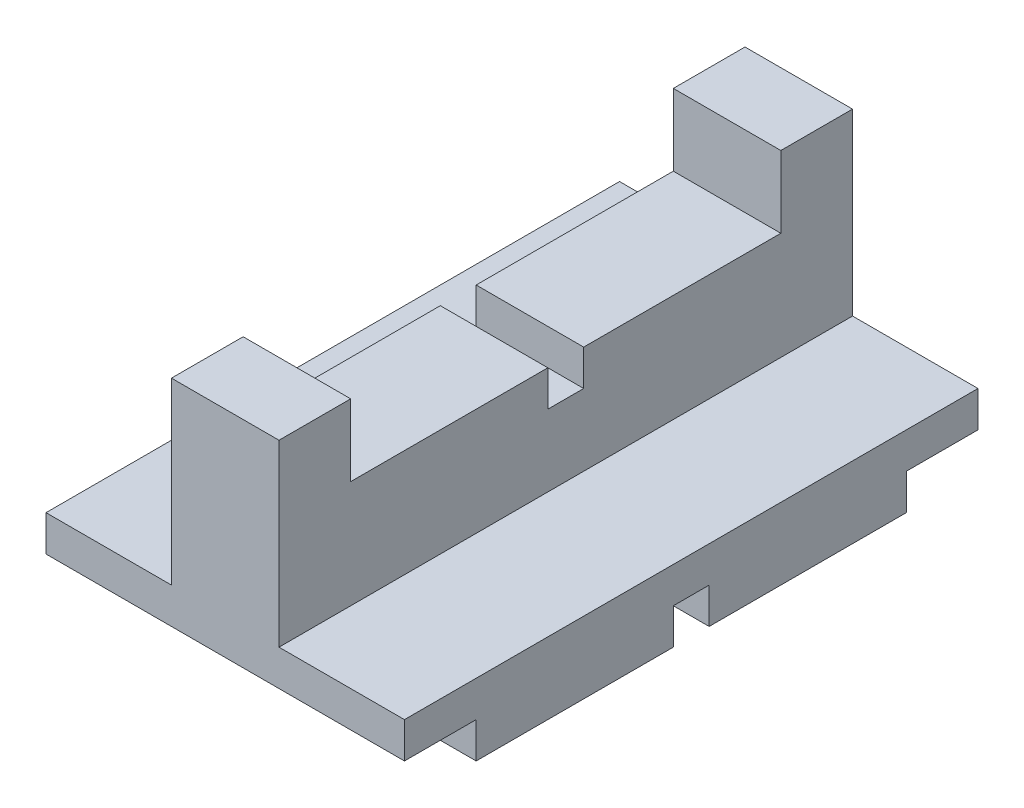
ISO-10303-21;
HEADER;
FILE_DESCRIPTION(('STEP AP214'),'2;1');
FILE_NAME('part.step','',(''),(''),'','','');
FILE_SCHEMA(('AUTOMOTIVE_DESIGN { 1 0 10303 214 1 1 1 1 }'));
ENDSEC;
DATA;
#1=APPLICATION_CONTEXT('core data for automotive mechanical design processes');
#2=APPLICATION_PROTOCOL_DEFINITION('international standard','automotive_design',2000,#1);
#3=PRODUCT_CONTEXT('',#1,'mechanical');
#4=PRODUCT('Part','Part','',(#3));
#5=PRODUCT_RELATED_PRODUCT_CATEGORY('part','',(#4));
#6=PRODUCT_DEFINITION_FORMATION('','',#4);
#7=PRODUCT_DEFINITION_CONTEXT('part definition',#1,'design');
#8=PRODUCT_DEFINITION('design','',#6,#7);
#9=PRODUCT_DEFINITION_SHAPE('','',#8);
#10=(LENGTH_UNIT() NAMED_UNIT(*) SI_UNIT(.MILLI.,.METRE.));
#11=(NAMED_UNIT(*) PLANE_ANGLE_UNIT() SI_UNIT($,.RADIAN.));
#12=(NAMED_UNIT(*) SI_UNIT($,.STERADIAN.) SOLID_ANGLE_UNIT());
#13=UNCERTAINTY_MEASURE_WITH_UNIT(LENGTH_MEASURE(1.E-05),#10,'distance_accuracy_value','');
#14=(GEOMETRIC_REPRESENTATION_CONTEXT(3) GLOBAL_UNCERTAINTY_ASSIGNED_CONTEXT((#13)) GLOBAL_UNIT_ASSIGNED_CONTEXT((#10,
#11,#12)) REPRESENTATION_CONTEXT('',''));
#15=CARTESIAN_POINT('',(0.,0.,0.));
#16=DIRECTION('',(0.,0.,1.));
#17=DIRECTION('',(1.,0.,0.));
#18=AXIS2_PLACEMENT_3D('',#15,#16,#17);
#19=CARTESIAN_POINT('',(-25.3606977763586,15.,70.));
#20=DIRECTION('',(0.,-1.,0.));
#21=DIRECTION('',(1.,0.,0.));
#22=AXIS2_PLACEMENT_3D('',#19,#20,#21);
#23=PLANE('',#22);
#24=DIRECTION('',(1.,0.,0.));
#25=VECTOR('',#24,1.);
#26=CARTESIAN_POINT('',(-25.3606977763586,15.,42.4997504993199));
#27=LINE('',#26,#25);
#28=CARTESIAN_POINT('',(-7.8606977763586,15.,42.4997504993199));
#29=VERTEX_POINT('',#28);
#30=CARTESIAN_POINT('',(7.13930222364139,15.,42.4997504993199));
#31=VERTEX_POINT('',#30);
#32=EDGE_CURVE('E200',#29,#31,#27,.T.);
#33=ORIENTED_EDGE('',*,*,#32,.F.);
#34=DIRECTION('',(0.,0.,-1.));
#35=VECTOR('',#34,1.);
#36=CARTESIAN_POINT('',(-7.8606977763586,15.,80.));
#37=LINE('',#36,#35);
#38=CARTESIAN_POINT('',(-7.8606977763586,15.,70.));
#39=VERTEX_POINT('',#38);
#40=EDGE_CURVE('E245',#39,#29,#37,.T.);
#41=ORIENTED_EDGE('',*,*,#40,.F.);
#42=DIRECTION('',(1.,0.,0.));
#43=VECTOR('',#42,1.);
#44=CARTESIAN_POINT('',(-25.3606977763586,15.,70.));
#45=LINE('',#44,#43);
#46=CARTESIAN_POINT('',(7.13930222364139,15.,70.));
#47=VERTEX_POINT('',#46);
#48=EDGE_CURVE('E225',#39,#47,#45,.T.);
#49=ORIENTED_EDGE('',*,*,#48,.T.);
#50=DIRECTION('',(0.,0.,-1.));
#51=VECTOR('',#50,1.);
#52=CARTESIAN_POINT('',(7.13930222364139,15.,70.));
#53=LINE('',#52,#51);
#54=EDGE_CURVE('E214',#47,#31,#53,.T.);
#55=ORIENTED_EDGE('',*,*,#54,.T.);
#56=EDGE_LOOP('',(#33,#41,#49,#55));
#57=FACE_BOUND('',#56,.T.);
#58=ADVANCED_FACE('F39',(#57),#23,.F.);
#59=CARTESIAN_POINT('',(-25.3606977763586,-10.,80.));
#60=DIRECTION('',(0.,1.,0.));
#61=DIRECTION('',(0.,0.,1.));
#62=AXIS2_PLACEMENT_3D('',#59,#60,#61);
#63=PLANE('',#62);
#64=DIRECTION('',(1.,0.,0.));
#65=VECTOR('',#64,1.);
#66=CARTESIAN_POINT('',(-25.3606977763586,-9.99999999999998,37.4997504993199));
#67=LINE('',#66,#65);
#68=CARTESIAN_POINT('',(-25.3606977763586,-9.99999999999998,37.4997504993199));
#69=VERTEX_POINT('',#68);
#70=CARTESIAN_POINT('',(24.6393022236414,-9.99999999999998,37.4997504993199));
#71=VERTEX_POINT('',#70);
#72=EDGE_CURVE('E379',#69,#71,#67,.T.);
#73=ORIENTED_EDGE('',*,*,#72,.F.);
#74=DIRECTION('',(0.,0.,-1.));
#75=VECTOR('',#74,1.);
#76=CARTESIAN_POINT('',(-25.3606977763586,-10.,80.));
#77=LINE('',#76,#75);
#78=CARTESIAN_POINT('',(-25.3606977763586,-9.99999999999998,10.));
#79=VERTEX_POINT('',#78);
#80=EDGE_CURVE('E298',#69,#79,#77,.T.);
#81=ORIENTED_EDGE('',*,*,#80,.T.);
#82=DIRECTION('',(1.,0.,0.));
#83=VECTOR('',#82,1.);
#84=CARTESIAN_POINT('',(-25.3606977763586,-9.99999999999998,10.));
#85=LINE('',#84,#83);
#86=CARTESIAN_POINT('',(24.6393022236414,-9.99999999999998,10.));
#87=VERTEX_POINT('',#86);
#88=EDGE_CURVE('E348',#79,#87,#85,.T.);
#89=ORIENTED_EDGE('',*,*,#88,.T.);
#90=DIRECTION('',(0.,0.,-1.));
#91=VECTOR('',#90,1.);
#92=CARTESIAN_POINT('',(24.6393022236414,-10.,80.));
#93=LINE('',#92,#91);
#94=EDGE_CURVE('E292',#71,#87,#93,.T.);
#95=ORIENTED_EDGE('',*,*,#94,.F.);
#96=EDGE_LOOP('',(#73,#81,#89,#95));
#97=FACE_BOUND('',#96,.T.);
#98=ADVANCED_FACE('F467',(#97),#63,.F.);
#99=CARTESIAN_POINT('',(-25.3606977763586,0.,80.));
#100=DIRECTION('',(1.,0.,0.));
#101=DIRECTION('',(0.,0.,-1.));
#102=AXIS2_PLACEMENT_3D('',#99,#100,#101);
#103=PLANE('',#102);
#104=ORIENTED_EDGE('',*,*,#80,.F.);
#105=DIRECTION('',(0.,1.,0.));
#106=VECTOR('',#105,1.);
#107=CARTESIAN_POINT('',(-25.3606977763586,-9.99999999999998,37.4997504993199));
#108=LINE('',#107,#106);
#109=CARTESIAN_POINT('',(-25.3606977763586,-4.99999999999998,37.4997504993199));
#110=VERTEX_POINT('',#109);
#111=EDGE_CURVE('E402',#69,#110,#108,.T.);
#112=ORIENTED_EDGE('',*,*,#111,.T.);
#113=DIRECTION('',(0.,0.,-1.));
#114=VECTOR('',#113,1.);
#115=CARTESIAN_POINT('',(-25.3606977763586,-4.99999999999998,42.4997504993199));
#116=LINE('',#115,#114);
#117=CARTESIAN_POINT('',(-25.3606977763586,-4.99999999999998,42.4997504993199));
#118=VERTEX_POINT('',#117);
#119=EDGE_CURVE('E391',#118,#110,#116,.T.);
#120=ORIENTED_EDGE('',*,*,#119,.F.);
#121=DIRECTION('',(0.,1.,0.));
#122=VECTOR('',#121,1.);
#123=CARTESIAN_POINT('',(-25.3606977763586,-9.99999999999998,42.4997504993199));
#124=LINE('',#123,#122);
#125=CARTESIAN_POINT('',(-25.3606977763586,-9.99999999999998,42.4997504993199));
#126=VERTEX_POINT('',#125);
#127=EDGE_CURVE('E393',#126,#118,#124,.T.);
#128=ORIENTED_EDGE('',*,*,#127,.F.);
#129=CARTESIAN_POINT('',(-25.3606977763586,-9.99999999999998,70.));
#130=VERTEX_POINT('',#129);
#131=EDGE_CURVE('E300',#130,#126,#77,.T.);
#132=ORIENTED_EDGE('',*,*,#131,.F.);
#133=DIRECTION('',(0.,-1.,0.));
#134=VECTOR('',#133,1.);
#135=CARTESIAN_POINT('',(-25.3606977763586,-4.99999999999998,70.));
#136=LINE('',#135,#134);
#137=CARTESIAN_POINT('',(-25.3606977763586,-4.99999999999998,70.));
#138=VERTEX_POINT('',#137);
#139=EDGE_CURVE('E336',#138,#130,#136,.T.);
#140=ORIENTED_EDGE('',*,*,#139,.F.);
#141=DIRECTION('',(0.,0.,-1.));
#142=VECTOR('',#141,1.);
#143=CARTESIAN_POINT('',(-25.3606977763586,-4.99999999999998,80.));
#144=LINE('',#143,#142);
#145=CARTESIAN_POINT('',(-25.3606977763586,-4.99999999999998,80.));
#146=VERTEX_POINT('',#145);
#147=EDGE_CURVE('E331',#146,#138,#144,.T.);
#148=ORIENTED_EDGE('',*,*,#147,.F.);
#149=DIRECTION('',(0.,-1.,0.));
#150=VECTOR('',#149,1.);
#151=CARTESIAN_POINT('',(-25.3606977763586,0.,80.));
#152=LINE('',#151,#150);
#153=CARTESIAN_POINT('',(-25.3606977763586,0.,80.));
#154=VERTEX_POINT('',#153);
#155=EDGE_CURVE('E252',#154,#146,#152,.T.);
#156=ORIENTED_EDGE('',*,*,#155,.F.);
#157=DIRECTION('',(0.,0.,-1.));
#158=VECTOR('',#157,1.);
#159=CARTESIAN_POINT('',(-25.3606977763586,0.,80.));
#160=LINE('',#159,#158);
#161=CARTESIAN_POINT('',(-25.3606977763586,0.,0.));
#162=VERTEX_POINT('',#161);
#163=EDGE_CURVE('E297',#154,#162,#160,.T.);
#164=ORIENTED_EDGE('',*,*,#163,.T.);
#165=DIRECTION('',(0.,-1.,0.));
#166=VECTOR('',#165,1.);
#167=CARTESIAN_POINT('',(-25.3606977763586,0.,0.));
#168=LINE('',#167,#166);
#169=CARTESIAN_POINT('',(-25.3606977763586,-4.99999999999998,0.));
#170=VERTEX_POINT('',#169);
#171=EDGE_CURVE('E270',#162,#170,#168,.T.);
#172=ORIENTED_EDGE('',*,*,#171,.T.);
#173=DIRECTION('',(0.,0.,-1.));
#174=VECTOR('',#173,1.);
#175=CARTESIAN_POINT('',(-25.3606977763586,-4.99999999999998,10.));
#176=LINE('',#175,#174);
#177=CARTESIAN_POINT('',(-25.3606977763586,-4.99999999999998,10.));
#178=VERTEX_POINT('',#177);
#179=EDGE_CURVE('E370',#178,#170,#176,.T.);
#180=ORIENTED_EDGE('',*,*,#179,.F.);
#181=DIRECTION('',(0.,-1.,0.));
#182=VECTOR('',#181,1.);
#183=CARTESIAN_POINT('',(-25.3606977763586,-4.99999999999998,10.));
#184=LINE('',#183,#182);
#185=EDGE_CURVE('E363',#178,#79,#184,.T.);
#186=ORIENTED_EDGE('',*,*,#185,.T.);
#187=EDGE_LOOP('',(#104,#112,#120,#128,#132,#140,#148,#156,#164,#172,#180,#186));
#188=FACE_BOUND('',#187,.T.);
#189=ADVANCED_FACE('F472',(#188),#103,.F.);
#190=ORIENTED_EDGE('',*,*,#131,.T.);
#191=DIRECTION('',(1.,0.,0.));
#192=VECTOR('',#191,1.);
#193=CARTESIAN_POINT('',(-25.3606977763586,-9.99999999999998,42.4997504993199));
#194=LINE('',#193,#192);
#195=CARTESIAN_POINT('',(24.6393022236414,-9.99999999999998,42.4997504993199));
#196=VERTEX_POINT('',#195);
#197=EDGE_CURVE('E381',#126,#196,#194,.T.);
#198=ORIENTED_EDGE('',*,*,#197,.T.);
#199=CARTESIAN_POINT('',(24.6393022236414,-9.99999999999998,70.));
#200=VERTEX_POINT('',#199);
#201=EDGE_CURVE('E291',#200,#196,#93,.T.);
#202=ORIENTED_EDGE('',*,*,#201,.F.);
#203=DIRECTION('',(1.,0.,0.));
#204=VECTOR('',#203,1.);
#205=CARTESIAN_POINT('',(-25.3606977763586,-9.99999999999998,70.));
#206=LINE('',#205,#204);
#207=EDGE_CURVE('E327',#130,#200,#206,.T.);
#208=ORIENTED_EDGE('',*,*,#207,.F.);
#209=EDGE_LOOP('',(#190,#198,#202,#208));
#210=FACE_BOUND('',#209,.T.);
#211=ADVANCED_FACE('F474',(#210),#63,.F.);
#212=CARTESIAN_POINT('',(-7.8606977763586,25.,80.));
#213=DIRECTION('',(0.,-1.,0.));
#214=DIRECTION('',(0.,0.,-1.));
#215=AXIS2_PLACEMENT_3D('',#212,#213,#214);
#216=PLANE('',#215);
#217=DIRECTION('',(1.,0.,0.));
#218=VECTOR('',#217,1.);
#219=CARTESIAN_POINT('',(-25.3606977763586,25.,70.));
#220=LINE('',#219,#218);
#221=CARTESIAN_POINT('',(-7.8606977763586,25.,70.));
#222=VERTEX_POINT('',#221);
#223=CARTESIAN_POINT('',(7.13930222364139,25.,70.));
#224=VERTEX_POINT('',#223);
#225=EDGE_CURVE('E235',#222,#224,#220,.T.);
#226=ORIENTED_EDGE('',*,*,#225,.F.);
#227=DIRECTION('',(0.,0.,-1.));
#228=VECTOR('',#227,1.);
#229=CARTESIAN_POINT('',(-7.8606977763586,25.,80.));
#230=LINE('',#229,#228);
#231=CARTESIAN_POINT('',(-7.8606977763586,25.,80.));
#232=VERTEX_POINT('',#231);
#233=EDGE_CURVE('E278',#232,#222,#230,.T.);
#234=ORIENTED_EDGE('',*,*,#233,.F.);
#235=DIRECTION('',(-1.,0.,0.));
#236=VECTOR('',#235,1.);
#237=CARTESIAN_POINT('',(-7.8606977763586,25.,80.));
#238=LINE('',#237,#236);
#239=CARTESIAN_POINT('',(7.13930222364139,25.,80.));
#240=VERTEX_POINT('',#239);
#241=EDGE_CURVE('E259',#240,#232,#238,.T.);
#242=ORIENTED_EDGE('',*,*,#241,.F.);
#243=DIRECTION('',(0.,0.,-1.));
#244=VECTOR('',#243,1.);
#245=CARTESIAN_POINT('',(7.13930222364139,25.,80.));
#246=LINE('',#245,#244);
#247=EDGE_CURVE('E282',#240,#224,#246,.T.);
#248=ORIENTED_EDGE('',*,*,#247,.T.);
#249=EDGE_LOOP('',(#226,#234,#242,#248));
#250=FACE_BOUND('',#249,.T.);
#251=ADVANCED_FACE('F439',(#250),#216,.F.);
#252=CARTESIAN_POINT('',(7.13930222364139,25.,80.));
#253=DIRECTION('',(-1.,0.,0.));
#254=DIRECTION('',(0.,-1.,0.));
#255=AXIS2_PLACEMENT_3D('',#252,#253,#254);
#256=PLANE('',#255);
#257=DIRECTION('',(0.,0.,1.));
#258=VECTOR('',#257,1.);
#259=CARTESIAN_POINT('',(7.1393022236414,10.,37.4997504993199));
#260=LINE('',#259,#258);
#261=CARTESIAN_POINT('',(7.1393022236414,10.,37.4997504993199));
#262=VERTEX_POINT('',#261);
#263=CARTESIAN_POINT('',(7.1393022236414,10.,42.4997504993199));
#264=VERTEX_POINT('',#263);
#265=EDGE_CURVE('E217',#262,#264,#260,.T.);
#266=ORIENTED_EDGE('',*,*,#265,.T.);
#267=DIRECTION('',(0.,1.,0.));
#268=VECTOR('',#267,1.);
#269=CARTESIAN_POINT('',(7.1393022236414,10.,42.4997504993199));
#270=LINE('',#269,#268);
#271=EDGE_CURVE('E205',#264,#31,#270,.T.);
#272=ORIENTED_EDGE('',*,*,#271,.T.);
#273=ORIENTED_EDGE('',*,*,#54,.F.);
#274=DIRECTION('',(0.,-1.,0.));
#275=VECTOR('',#274,1.);
#276=CARTESIAN_POINT('',(7.13930222364139,25.,70.));
#277=LINE('',#276,#275);
#278=EDGE_CURVE('E226',#224,#47,#277,.T.);
#279=ORIENTED_EDGE('',*,*,#278,.F.);
#280=ORIENTED_EDGE('',*,*,#247,.F.);
#281=DIRECTION('',(0.,1.,0.));
#282=VECTOR('',#281,1.);
#283=CARTESIAN_POINT('',(7.13930222364139,25.,80.));
#284=LINE('',#283,#282);
#285=CARTESIAN_POINT('',(7.1393022236414,0.,80.));
#286=VERTEX_POINT('',#285);
#287=EDGE_CURVE('E257',#286,#240,#284,.T.);
#288=ORIENTED_EDGE('',*,*,#287,.F.);
#289=DIRECTION('',(0.,0.,-1.));
#290=VECTOR('',#289,1.);
#291=CARTESIAN_POINT('',(7.1393022236414,0.,80.));
#292=LINE('',#291,#290);
#293=CARTESIAN_POINT('',(7.1393022236414,0.,0.));
#294=VERTEX_POINT('',#293);
#295=EDGE_CURVE('E288',#286,#294,#292,.T.);
#296=ORIENTED_EDGE('',*,*,#295,.T.);
#297=DIRECTION('',(0.,1.,0.));
#298=VECTOR('',#297,1.);
#299=CARTESIAN_POINT('',(7.13930222364139,25.,0.));
#300=LINE('',#299,#298);
#301=CARTESIAN_POINT('',(7.13930222364139,25.,0.));
#302=VERTEX_POINT('',#301);
#303=EDGE_CURVE('E274',#294,#302,#300,.T.);
#304=ORIENTED_EDGE('',*,*,#303,.T.);
#305=CARTESIAN_POINT('',(7.13930222364139,25.,10.));
#306=VERTEX_POINT('',#305);
#307=EDGE_CURVE('E284',#306,#302,#246,.T.);
#308=ORIENTED_EDGE('',*,*,#307,.F.);
#309=DIRECTION('',(0.,-1.,0.));
#310=VECTOR('',#309,1.);
#311=CARTESIAN_POINT('',(7.13930222364139,25.,10.));
#312=LINE('',#311,#310);
#313=CARTESIAN_POINT('',(7.13930222364139,15.,10.));
#314=VERTEX_POINT('',#313);
#315=EDGE_CURVE('E221',#306,#314,#312,.T.);
#316=ORIENTED_EDGE('',*,*,#315,.T.);
#317=CARTESIAN_POINT('',(7.13930222364139,15.,37.4997504993199));
#318=VERTEX_POINT('',#317);
#319=EDGE_CURVE('E222',#318,#314,#53,.T.);
#320=ORIENTED_EDGE('',*,*,#319,.F.);
#321=DIRECTION('',(0.,1.,0.));
#322=VECTOR('',#321,1.);
#323=CARTESIAN_POINT('',(7.1393022236414,10.,37.4997504993199));
#324=LINE('',#323,#322);
#325=EDGE_CURVE('E209',#262,#318,#324,.T.);
#326=ORIENTED_EDGE('',*,*,#325,.F.);
#327=EDGE_LOOP('',(#266,#272,#273,#279,#280,#288,#296,#304,#308,#316,#320,#326));
#328=FACE_BOUND('',#327,.T.);
#329=ADVANCED_FACE('F212',(#328),#256,.F.);
#330=CARTESIAN_POINT('',(-7.8606977763586,0.,80.));
#331=DIRECTION('',(1.,0.,0.));
#332=DIRECTION('',(0.,0.,-1.));
#333=AXIS2_PLACEMENT_3D('',#330,#331,#332);
#334=PLANE('',#333);
#335=DIRECTION('',(0.,0.,1.));
#336=VECTOR('',#335,1.);
#337=CARTESIAN_POINT('',(-7.8606977763586,10.,80.));
#338=LINE('',#337,#336);
#339=CARTESIAN_POINT('',(-7.8606977763586,10.,37.4997504993199));
#340=VERTEX_POINT('',#339);
#341=CARTESIAN_POINT('',(-7.8606977763586,10.,42.4997504993199));
#342=VERTEX_POINT('',#341);
#343=EDGE_CURVE('E50',#340,#342,#338,.T.);
#344=ORIENTED_EDGE('',*,*,#343,.F.);
#345=DIRECTION('',(0.,1.,0.));
#346=VECTOR('',#345,1.);
#347=CARTESIAN_POINT('',(-7.8606977763586,0.,37.4997504993199));
#348=LINE('',#347,#346);
#349=CARTESIAN_POINT('',(-7.8606977763586,15.,37.4997504993199));
#350=VERTEX_POINT('',#349);
#351=EDGE_CURVE('E11',#340,#350,#348,.T.);
#352=ORIENTED_EDGE('',*,*,#351,.T.);
#353=CARTESIAN_POINT('',(-7.8606977763586,15.,10.));
#354=VERTEX_POINT('',#353);
#355=EDGE_CURVE('E234',#350,#354,#37,.T.);
#356=ORIENTED_EDGE('',*,*,#355,.T.);
#357=DIRECTION('',(0.,-1.,0.));
#358=VECTOR('',#357,1.);
#359=CARTESIAN_POINT('',(-7.8606977763586,0.,10.));
#360=LINE('',#359,#358);
#361=CARTESIAN_POINT('',(-7.8606977763586,25.,10.));
#362=VERTEX_POINT('',#361);
#363=EDGE_CURVE('E306',#362,#354,#360,.T.);
#364=ORIENTED_EDGE('',*,*,#363,.F.);
#365=CARTESIAN_POINT('',(-7.8606977763586,25.,0.));
#366=VERTEX_POINT('',#365);
#367=EDGE_CURVE('E264',#362,#366,#230,.T.);
#368=ORIENTED_EDGE('',*,*,#367,.T.);
#369=DIRECTION('',(0.,-1.,0.));
#370=VECTOR('',#369,1.);
#371=CARTESIAN_POINT('',(-7.8606977763586,0.,0.));
#372=LINE('',#371,#370);
#373=CARTESIAN_POINT('',(-7.8606977763586,0.,0.));
#374=VERTEX_POINT('',#373);
#375=EDGE_CURVE('E242',#366,#374,#372,.T.);
#376=ORIENTED_EDGE('',*,*,#375,.T.);
#377=DIRECTION('',(0.,0.,-1.));
#378=VECTOR('',#377,1.);
#379=CARTESIAN_POINT('',(-7.8606977763586,0.,80.));
#380=LINE('',#379,#378);
#381=CARTESIAN_POINT('',(-7.8606977763586,0.,80.));
#382=VERTEX_POINT('',#381);
#383=EDGE_CURVE('E303',#382,#374,#380,.T.);
#384=ORIENTED_EDGE('',*,*,#383,.F.);
#385=DIRECTION('',(0.,-1.,0.));
#386=VECTOR('',#385,1.);
#387=CARTESIAN_POINT('',(-7.8606977763586,0.,80.));
#388=LINE('',#387,#386);
#389=EDGE_CURVE('E244',#232,#382,#388,.T.);
#390=ORIENTED_EDGE('',*,*,#389,.F.);
#391=ORIENTED_EDGE('',*,*,#233,.T.);
#392=DIRECTION('',(0.,-1.,0.));
#393=VECTOR('',#392,1.);
#394=CARTESIAN_POINT('',(-7.8606977763586,0.,70.));
#395=LINE('',#394,#393);
#396=EDGE_CURVE('E307',#222,#39,#395,.T.);
#397=ORIENTED_EDGE('',*,*,#396,.T.);
#398=ORIENTED_EDGE('',*,*,#40,.T.);
#399=DIRECTION('',(0.,1.,0.));
#400=VECTOR('',#399,1.);
#401=CARTESIAN_POINT('',(-7.8606977763586,0.,42.4997504993199));
#402=LINE('',#401,#400);
#403=EDGE_CURVE('E204',#342,#29,#402,.T.);
#404=ORIENTED_EDGE('',*,*,#403,.F.);
#405=EDGE_LOOP('',(#344,#352,#356,#364,#368,#376,#384,#390,#391,#397,#398,#404));
#406=FACE_BOUND('',#405,.T.);
#407=ADVANCED_FACE('F41',(#406),#334,.F.);
#408=CARTESIAN_POINT('',(-7.8606977763586,0.,80.));
#409=DIRECTION('',(0.,-1.,0.));
#410=DIRECTION('',(1.,0.,0.));
#411=AXIS2_PLACEMENT_3D('',#408,#409,#410);
#412=PLANE('',#411);
#413=DIRECTION('',(-1.,0.,0.));
#414=VECTOR('',#413,1.);
#415=CARTESIAN_POINT('',(-7.8606977763586,0.,0.));
#416=LINE('',#415,#414);
#417=EDGE_CURVE('E261',#374,#162,#416,.T.);
#418=ORIENTED_EDGE('',*,*,#417,.T.);
#419=ORIENTED_EDGE('',*,*,#163,.F.);
#420=DIRECTION('',(-1.,0.,0.));
#421=VECTOR('',#420,1.);
#422=CARTESIAN_POINT('',(-7.8606977763586,0.,80.));
#423=LINE('',#422,#421);
#424=EDGE_CURVE('E247',#382,#154,#423,.T.);
#425=ORIENTED_EDGE('',*,*,#424,.F.);
#426=ORIENTED_EDGE('',*,*,#383,.T.);
#427=EDGE_LOOP('',(#418,#419,#425,#426));
#428=FACE_BOUND('',#427,.T.);
#429=ADVANCED_FACE('F432',(#428),#412,.F.);
#430=CARTESIAN_POINT('',(24.6393022236414,-10.,80.));
#431=DIRECTION('',(-1.,0.,0.));
#432=DIRECTION('',(0.,-1.,0.));
#433=AXIS2_PLACEMENT_3D('',#430,#431,#432);
#434=PLANE('',#433);
#435=ORIENTED_EDGE('',*,*,#201,.T.);
#436=DIRECTION('',(0.,1.,0.));
#437=VECTOR('',#436,1.);
#438=CARTESIAN_POINT('',(24.6393022236414,-9.99999999999998,42.4997504993199));
#439=LINE('',#438,#437);
#440=CARTESIAN_POINT('',(24.6393022236414,-4.99999999999998,42.4997504993199));
#441=VERTEX_POINT('',#440);
#442=EDGE_CURVE('E394',#196,#441,#439,.T.);
#443=ORIENTED_EDGE('',*,*,#442,.T.);
#444=DIRECTION('',(0.,0.,-1.));
#445=VECTOR('',#444,1.);
#446=CARTESIAN_POINT('',(24.6393022236414,-4.99999999999998,42.4997504993199));
#447=LINE('',#446,#445);
#448=CARTESIAN_POINT('',(24.6393022236414,-4.99999999999998,37.4997504993199));
#449=VERTEX_POINT('',#448);
#450=EDGE_CURVE('E400',#441,#449,#447,.T.);
#451=ORIENTED_EDGE('',*,*,#450,.T.);
#452=DIRECTION('',(0.,1.,0.));
#453=VECTOR('',#452,1.);
#454=CARTESIAN_POINT('',(24.6393022236414,-9.99999999999998,37.4997504993199));
#455=LINE('',#454,#453);
#456=EDGE_CURVE('E65',#71,#449,#455,.T.);
#457=ORIENTED_EDGE('',*,*,#456,.F.);
#458=ORIENTED_EDGE('',*,*,#94,.T.);
#459=DIRECTION('',(0.,-1.,0.));
#460=VECTOR('',#459,1.);
#461=CARTESIAN_POINT('',(24.6393022236414,-4.99999999999998,10.));
#462=LINE('',#461,#460);
#463=CARTESIAN_POINT('',(24.6393022236414,-4.99999999999998,10.));
#464=VERTEX_POINT('',#463);
#465=EDGE_CURVE('E360',#464,#87,#462,.T.);
#466=ORIENTED_EDGE('',*,*,#465,.F.);
#467=DIRECTION('',(0.,0.,-1.));
#468=VECTOR('',#467,1.);
#469=CARTESIAN_POINT('',(24.6393022236414,-4.99999999999998,10.));
#470=LINE('',#469,#468);
#471=CARTESIAN_POINT('',(24.6393022236414,-4.99999999999998,0.));
#472=VERTEX_POINT('',#471);
#473=EDGE_CURVE('E374',#464,#472,#470,.T.);
#474=ORIENTED_EDGE('',*,*,#473,.T.);
#475=DIRECTION('',(0.,1.,0.));
#476=VECTOR('',#475,1.);
#477=CARTESIAN_POINT('',(24.6393022236414,-10.,0.));
#478=LINE('',#477,#476);
#479=CARTESIAN_POINT('',(24.6393022236414,0.,0.));
#480=VERTEX_POINT('',#479);
#481=EDGE_CURVE('E269',#472,#480,#478,.T.);
#482=ORIENTED_EDGE('',*,*,#481,.T.);
#483=DIRECTION('',(0.,0.,-1.));
#484=VECTOR('',#483,1.);
#485=CARTESIAN_POINT('',(24.6393022236414,0.,80.));
#486=LINE('',#485,#484);
#487=CARTESIAN_POINT('',(24.6393022236414,0.,80.));
#488=VERTEX_POINT('',#487);
#489=EDGE_CURVE('E287',#488,#480,#486,.T.);
#490=ORIENTED_EDGE('',*,*,#489,.F.);
#491=DIRECTION('',(0.,1.,0.));
#492=VECTOR('',#491,1.);
#493=CARTESIAN_POINT('',(24.6393022236414,-10.,80.));
#494=LINE('',#493,#492);
#495=CARTESIAN_POINT('',(24.6393022236414,-4.99999999999998,80.));
#496=VERTEX_POINT('',#495);
#497=EDGE_CURVE('E251',#496,#488,#494,.T.);
#498=ORIENTED_EDGE('',*,*,#497,.F.);
#499=DIRECTION('',(0.,0.,-1.));
#500=VECTOR('',#499,1.);
#501=CARTESIAN_POINT('',(24.6393022236414,-4.99999999999998,80.));
#502=LINE('',#501,#500);
#503=CARTESIAN_POINT('',(24.6393022236414,-4.99999999999998,70.));
#504=VERTEX_POINT('',#503);
#505=EDGE_CURVE('E333',#496,#504,#502,.T.);
#506=ORIENTED_EDGE('',*,*,#505,.T.);
#507=DIRECTION('',(0.,-1.,0.));
#508=VECTOR('',#507,1.);
#509=CARTESIAN_POINT('',(24.6393022236414,-4.99999999999998,70.));
#510=LINE('',#509,#508);
#511=EDGE_CURVE('E344',#504,#200,#510,.T.);
#512=ORIENTED_EDGE('',*,*,#511,.T.);
#513=EDGE_LOOP('',(#435,#443,#451,#457,#458,#466,#474,#482,#490,#498,#506,#512));
#514=FACE_BOUND('',#513,.T.);
#515=ADVANCED_FACE('F449',(#514),#434,.F.);
#516=CARTESIAN_POINT('',(24.6393022236414,0.,80.));
#517=DIRECTION('',(0.,-1.,0.));
#518=DIRECTION('',(1.,0.,0.));
#519=AXIS2_PLACEMENT_3D('',#516,#517,#518);
#520=PLANE('',#519);
#521=DIRECTION('',(-1.,0.,0.));
#522=VECTOR('',#521,1.);
#523=CARTESIAN_POINT('',(24.6393022236414,0.,0.));
#524=LINE('',#523,#522);
#525=EDGE_CURVE('E275',#480,#294,#524,.T.);
#526=ORIENTED_EDGE('',*,*,#525,.T.);
#527=ORIENTED_EDGE('',*,*,#295,.F.);
#528=DIRECTION('',(-1.,0.,0.));
#529=VECTOR('',#528,1.);
#530=CARTESIAN_POINT('',(24.6393022236414,0.,80.));
#531=LINE('',#530,#529);
#532=EDGE_CURVE('E256',#488,#286,#531,.T.);
#533=ORIENTED_EDGE('',*,*,#532,.F.);
#534=ORIENTED_EDGE('',*,*,#489,.T.);
#535=EDGE_LOOP('',(#526,#527,#533,#534));
#536=FACE_BOUND('',#535,.T.);
#537=ADVANCED_FACE('F447',(#536),#520,.F.);
#538=ORIENTED_EDGE('',*,*,#367,.F.);
#539=DIRECTION('',(1.,0.,0.));
#540=VECTOR('',#539,1.);
#541=CARTESIAN_POINT('',(-25.3606977763586,25.,10.));
#542=LINE('',#541,#540);
#543=EDGE_CURVE('E232',#362,#306,#542,.T.);
#544=ORIENTED_EDGE('',*,*,#543,.T.);
#545=ORIENTED_EDGE('',*,*,#307,.T.);
#546=DIRECTION('',(-1.,0.,0.));
#547=VECTOR('',#546,1.);
#548=CARTESIAN_POINT('',(-7.8606977763586,25.,0.));
#549=LINE('',#548,#547);
#550=EDGE_CURVE('E248',#302,#366,#549,.T.);
#551=ORIENTED_EDGE('',*,*,#550,.T.);
#552=EDGE_LOOP('',(#538,#544,#545,#551));
#553=FACE_BOUND('',#552,.T.);
#554=ADVANCED_FACE('F421',(#553),#216,.F.);
#555=CARTESIAN_POINT('',(0.,0.,80.));
#556=DIRECTION('',(0.,0.,-1.));
#557=DIRECTION('',(-1.,0.,0.));
#558=AXIS2_PLACEMENT_3D('',#555,#556,#557);
#559=PLANE('',#558);
#560=ORIENTED_EDGE('',*,*,#155,.T.);
#561=DIRECTION('',(1.,0.,0.));
#562=VECTOR('',#561,1.);
#563=CARTESIAN_POINT('',(-25.3606977763586,-4.99999999999998,80.));
#564=LINE('',#563,#562);
#565=EDGE_CURVE('E325',#146,#496,#564,.T.);
#566=ORIENTED_EDGE('',*,*,#565,.T.);
#567=ORIENTED_EDGE('',*,*,#497,.T.);
#568=ORIENTED_EDGE('',*,*,#532,.T.);
#569=ORIENTED_EDGE('',*,*,#287,.T.);
#570=ORIENTED_EDGE('',*,*,#241,.T.);
#571=ORIENTED_EDGE('',*,*,#389,.T.);
#572=ORIENTED_EDGE('',*,*,#424,.T.);
#573=EDGE_LOOP('',(#560,#566,#567,#568,#569,#570,#571,#572));
#574=FACE_BOUND('',#573,.T.);
#575=ADVANCED_FACE('F436',(#574),#559,.F.);
#576=CARTESIAN_POINT('',(0.,0.,0.));
#577=DIRECTION('',(0.,0.,-1.));
#578=DIRECTION('',(-1.,0.,0.));
#579=AXIS2_PLACEMENT_3D('',#576,#577,#578);
#580=PLANE('',#579);
#581=DIRECTION('',(1.,0.,0.));
#582=VECTOR('',#581,1.);
#583=CARTESIAN_POINT('',(-25.3606977763586,-4.99999999999998,0.));
#584=LINE('',#583,#582);
#585=EDGE_CURVE('E358',#170,#472,#584,.T.);
#586=ORIENTED_EDGE('',*,*,#585,.F.);
#587=ORIENTED_EDGE('',*,*,#171,.F.);
#588=ORIENTED_EDGE('',*,*,#417,.F.);
#589=ORIENTED_EDGE('',*,*,#375,.F.);
#590=ORIENTED_EDGE('',*,*,#550,.F.);
#591=ORIENTED_EDGE('',*,*,#303,.F.);
#592=ORIENTED_EDGE('',*,*,#525,.F.);
#593=ORIENTED_EDGE('',*,*,#481,.F.);
#594=EDGE_LOOP('',(#586,#587,#588,#589,#590,#591,#592,#593));
#595=FACE_BOUND('',#594,.T.);
#596=ADVANCED_FACE('F429',(#595),#580,.T.);
#597=CARTESIAN_POINT('',(-25.3606977763586,25.,70.));
#598=DIRECTION('',(0.,0.,1.));
#599=DIRECTION('',(1.,0.,0.));
#600=AXIS2_PLACEMENT_3D('',#597,#598,#599);
#601=PLANE('',#600);
#602=ORIENTED_EDGE('',*,*,#225,.T.);
#603=ORIENTED_EDGE('',*,*,#278,.T.);
#604=ORIENTED_EDGE('',*,*,#48,.F.);
#605=ORIENTED_EDGE('',*,*,#396,.F.);
#606=EDGE_LOOP('',(#602,#603,#604,#605));
#607=FACE_BOUND('',#606,.T.);
#608=ADVANCED_FACE('F316',(#607),#601,.F.);
#609=CARTESIAN_POINT('',(-25.3606977763586,25.,10.));
#610=DIRECTION('',(0.,0.,1.));
#611=DIRECTION('',(1.,0.,0.));
#612=AXIS2_PLACEMENT_3D('',#609,#610,#611);
#613=PLANE('',#612);
#614=ORIENTED_EDGE('',*,*,#363,.T.);
#615=DIRECTION('',(1.,0.,0.));
#616=VECTOR('',#615,1.);
#617=CARTESIAN_POINT('',(-25.3606977763586,15.,10.));
#618=LINE('',#617,#616);
#619=EDGE_CURVE('E238',#354,#314,#618,.T.);
#620=ORIENTED_EDGE('',*,*,#619,.T.);
#621=ORIENTED_EDGE('',*,*,#315,.F.);
#622=ORIENTED_EDGE('',*,*,#543,.F.);
#623=EDGE_LOOP('',(#614,#620,#621,#622));
#624=FACE_BOUND('',#623,.T.);
#625=ADVANCED_FACE('F417',(#624),#613,.T.);
#626=ORIENTED_EDGE('',*,*,#355,.F.);
#627=DIRECTION('',(1.,0.,0.));
#628=VECTOR('',#627,1.);
#629=CARTESIAN_POINT('',(-25.3606977763586,15.,37.4997504993199));
#630=LINE('',#629,#628);
#631=EDGE_CURVE('E397',#350,#318,#630,.T.);
#632=ORIENTED_EDGE('',*,*,#631,.T.);
#633=ORIENTED_EDGE('',*,*,#319,.T.);
#634=ORIENTED_EDGE('',*,*,#619,.F.);
#635=EDGE_LOOP('',(#626,#632,#633,#634));
#636=FACE_BOUND('',#635,.T.);
#637=ADVANCED_FACE('F411',(#636),#23,.F.);
#638=CARTESIAN_POINT('',(-25.3606977763586,-4.99999999999998,80.));
#639=DIRECTION('',(0.,-1.,0.));
#640=DIRECTION('',(0.,0.,-1.));
#641=AXIS2_PLACEMENT_3D('',#638,#639,#640);
#642=PLANE('',#641);
#643=ORIENTED_EDGE('',*,*,#505,.F.);
#644=ORIENTED_EDGE('',*,*,#565,.F.);
#645=ORIENTED_EDGE('',*,*,#147,.T.);
#646=DIRECTION('',(1.,0.,0.));
#647=VECTOR('',#646,1.);
#648=CARTESIAN_POINT('',(-25.3606977763586,-4.99999999999998,70.));
#649=LINE('',#648,#647);
#650=EDGE_CURVE('E323',#138,#504,#649,.T.);
#651=ORIENTED_EDGE('',*,*,#650,.T.);
#652=EDGE_LOOP('',(#643,#644,#645,#651));
#653=FACE_BOUND('',#652,.T.);
#654=ADVANCED_FACE('F446',(#653),#642,.T.);
#655=CARTESIAN_POINT('',(-25.3606977763586,-4.99999999999998,70.));
#656=DIRECTION('',(0.,0.,1.));
#657=DIRECTION('',(1.,0.,0.));
#658=AXIS2_PLACEMENT_3D('',#655,#656,#657);
#659=PLANE('',#658);
#660=ORIENTED_EDGE('',*,*,#511,.F.);
#661=ORIENTED_EDGE('',*,*,#650,.F.);
#662=ORIENTED_EDGE('',*,*,#139,.T.);
#663=ORIENTED_EDGE('',*,*,#207,.T.);
#664=EDGE_LOOP('',(#660,#661,#662,#663));
#665=FACE_BOUND('',#664,.T.);
#666=ADVANCED_FACE('F451',(#665),#659,.T.);
#667=CARTESIAN_POINT('',(-25.3606977763586,-4.99999999999998,10.));
#668=DIRECTION('',(0.,0.,1.));
#669=DIRECTION('',(1.,0.,0.));
#670=AXIS2_PLACEMENT_3D('',#667,#668,#669);
#671=PLANE('',#670);
#672=ORIENTED_EDGE('',*,*,#465,.T.);
#673=ORIENTED_EDGE('',*,*,#88,.F.);
#674=ORIENTED_EDGE('',*,*,#185,.F.);
#675=DIRECTION('',(1.,0.,0.));
#676=VECTOR('',#675,1.);
#677=CARTESIAN_POINT('',(-25.3606977763586,-4.99999999999998,10.));
#678=LINE('',#677,#676);
#679=EDGE_CURVE('E353',#178,#464,#678,.T.);
#680=ORIENTED_EDGE('',*,*,#679,.T.);
#681=EDGE_LOOP('',(#672,#673,#674,#680));
#682=FACE_BOUND('',#681,.T.);
#683=ADVANCED_FACE('F452',(#682),#671,.F.);
#684=CARTESIAN_POINT('',(-25.3606977763586,-4.99999999999998,10.));
#685=DIRECTION('',(0.,-1.,0.));
#686=DIRECTION('',(0.,0.,-1.));
#687=AXIS2_PLACEMENT_3D('',#684,#685,#686);
#688=PLANE('',#687);
#689=ORIENTED_EDGE('',*,*,#473,.F.);
#690=ORIENTED_EDGE('',*,*,#679,.F.);
#691=ORIENTED_EDGE('',*,*,#179,.T.);
#692=ORIENTED_EDGE('',*,*,#585,.T.);
#693=EDGE_LOOP('',(#689,#690,#691,#692));
#694=FACE_BOUND('',#693,.T.);
#695=ADVANCED_FACE('F456',(#694),#688,.T.);
#696=CARTESIAN_POINT('',(-25.3606977763586,-4.99999999999998,42.4997504993199));
#697=DIRECTION('',(0.,-1.,0.));
#698=DIRECTION('',(0.,0.,-1.));
#699=AXIS2_PLACEMENT_3D('',#696,#697,#698);
#700=PLANE('',#699);
#701=ORIENTED_EDGE('',*,*,#450,.F.);
#702=DIRECTION('',(1.,0.,0.));
#703=VECTOR('',#702,1.);
#704=CARTESIAN_POINT('',(-25.3606977763586,-4.99999999999998,42.4997504993199));
#705=LINE('',#704,#703);
#706=EDGE_CURVE('E388',#118,#441,#705,.T.);
#707=ORIENTED_EDGE('',*,*,#706,.F.);
#708=ORIENTED_EDGE('',*,*,#119,.T.);
#709=DIRECTION('',(1.,0.,0.));
#710=VECTOR('',#709,1.);
#711=CARTESIAN_POINT('',(-25.3606977763586,-4.99999999999998,37.4997504993199));
#712=LINE('',#711,#710);
#713=EDGE_CURVE('E376',#110,#449,#712,.T.);
#714=ORIENTED_EDGE('',*,*,#713,.T.);
#715=EDGE_LOOP('',(#701,#707,#708,#714));
#716=FACE_BOUND('',#715,.T.);
#717=ADVANCED_FACE('F569',(#716),#700,.T.);
#718=CARTESIAN_POINT('',(-25.3606977763586,-9.99999999999998,37.4997504993199));
#719=DIRECTION('',(0.,0.,-1.));
#720=DIRECTION('',(-1.,0.,0.));
#721=AXIS2_PLACEMENT_3D('',#718,#719,#720);
#722=PLANE('',#721);
#723=ORIENTED_EDGE('',*,*,#456,.T.);
#724=ORIENTED_EDGE('',*,*,#713,.F.);
#725=ORIENTED_EDGE('',*,*,#111,.F.);
#726=ORIENTED_EDGE('',*,*,#72,.T.);
#727=EDGE_LOOP('',(#723,#724,#725,#726));
#728=FACE_BOUND('',#727,.T.);
#729=ADVANCED_FACE('F582',(#728),#722,.F.);
#730=CARTESIAN_POINT('',(-25.3606977763586,-9.99999999999998,42.4997504993199));
#731=DIRECTION('',(0.,0.,-1.));
#732=DIRECTION('',(-1.,0.,0.));
#733=AXIS2_PLACEMENT_3D('',#730,#731,#732);
#734=PLANE('',#733);
#735=ORIENTED_EDGE('',*,*,#442,.F.);
#736=ORIENTED_EDGE('',*,*,#197,.F.);
#737=ORIENTED_EDGE('',*,*,#127,.T.);
#738=ORIENTED_EDGE('',*,*,#706,.T.);
#739=EDGE_LOOP('',(#735,#736,#737,#738));
#740=FACE_BOUND('',#739,.T.);
#741=ADVANCED_FACE('F593',(#740),#734,.T.);
#742=CARTESIAN_POINT('',(-25.3606977763586,10.,37.4997504993199));
#743=DIRECTION('',(0.,0.,-1.));
#744=DIRECTION('',(-1.,0.,0.));
#745=AXIS2_PLACEMENT_3D('',#742,#743,#744);
#746=PLANE('',#745);
#747=DIRECTION('',(1.,0.,0.));
#748=VECTOR('',#747,1.);
#749=CARTESIAN_POINT('',(-25.3606977763586,10.,37.4997504993199));
#750=LINE('',#749,#748);
#751=EDGE_CURVE('E317',#340,#262,#750,.T.);
#752=ORIENTED_EDGE('',*,*,#751,.T.);
#753=ORIENTED_EDGE('',*,*,#325,.T.);
#754=ORIENTED_EDGE('',*,*,#631,.F.);
#755=ORIENTED_EDGE('',*,*,#351,.F.);
#756=EDGE_LOOP('',(#752,#753,#754,#755));
#757=FACE_BOUND('',#756,.T.);
#758=ADVANCED_FACE('F413',(#757),#746,.F.);
#759=CARTESIAN_POINT('',(-25.3606977763586,10.,37.4997504993199));
#760=DIRECTION('',(0.,1.,0.));
#761=DIRECTION('',(-1.,0.,0.));
#762=AXIS2_PLACEMENT_3D('',#759,#760,#761);
#763=PLANE('',#762);
#764=ORIENTED_EDGE('',*,*,#343,.T.);
#765=DIRECTION('',(1.,0.,0.));
#766=VECTOR('',#765,1.);
#767=CARTESIAN_POINT('',(-25.3606977763586,10.,42.4997504993199));
#768=LINE('',#767,#766);
#769=EDGE_CURVE('E53',#342,#264,#768,.T.);
#770=ORIENTED_EDGE('',*,*,#769,.T.);
#771=ORIENTED_EDGE('',*,*,#265,.F.);
#772=ORIENTED_EDGE('',*,*,#751,.F.);
#773=EDGE_LOOP('',(#764,#770,#771,#772));
#774=FACE_BOUND('',#773,.T.);
#775=ADVANCED_FACE('F314',(#774),#763,.T.);
#776=CARTESIAN_POINT('',(-25.3606977763586,10.,42.4997504993199));
#777=DIRECTION('',(0.,0.,-1.));
#778=DIRECTION('',(-1.,0.,0.));
#779=AXIS2_PLACEMENT_3D('',#776,#777,#778);
#780=PLANE('',#779);
#781=ORIENTED_EDGE('',*,*,#403,.T.);
#782=ORIENTED_EDGE('',*,*,#32,.T.);
#783=ORIENTED_EDGE('',*,*,#271,.F.);
#784=ORIENTED_EDGE('',*,*,#769,.F.);
#785=EDGE_LOOP('',(#781,#782,#783,#784));
#786=FACE_BOUND('',#785,.T.);
#787=ADVANCED_FACE('F203',(#786),#780,.T.);
#788=CLOSED_SHELL('',(#58,#98,#189,#211,#251,#329,#407,#429,#515,#537,#554,#575,#596,#608,#625,
#637,#654,#666,#683,#695,#717,#729,#741,#758,#775,#787));
#789=MANIFOLD_SOLID_BREP('B2',#788);
#790=ADVANCED_BREP_SHAPE_REPRESENTATION('',(#18,#789),#14);
#791=SHAPE_DEFINITION_REPRESENTATION(#9,#790);
ENDSEC;
END-ISO-10303-21;
